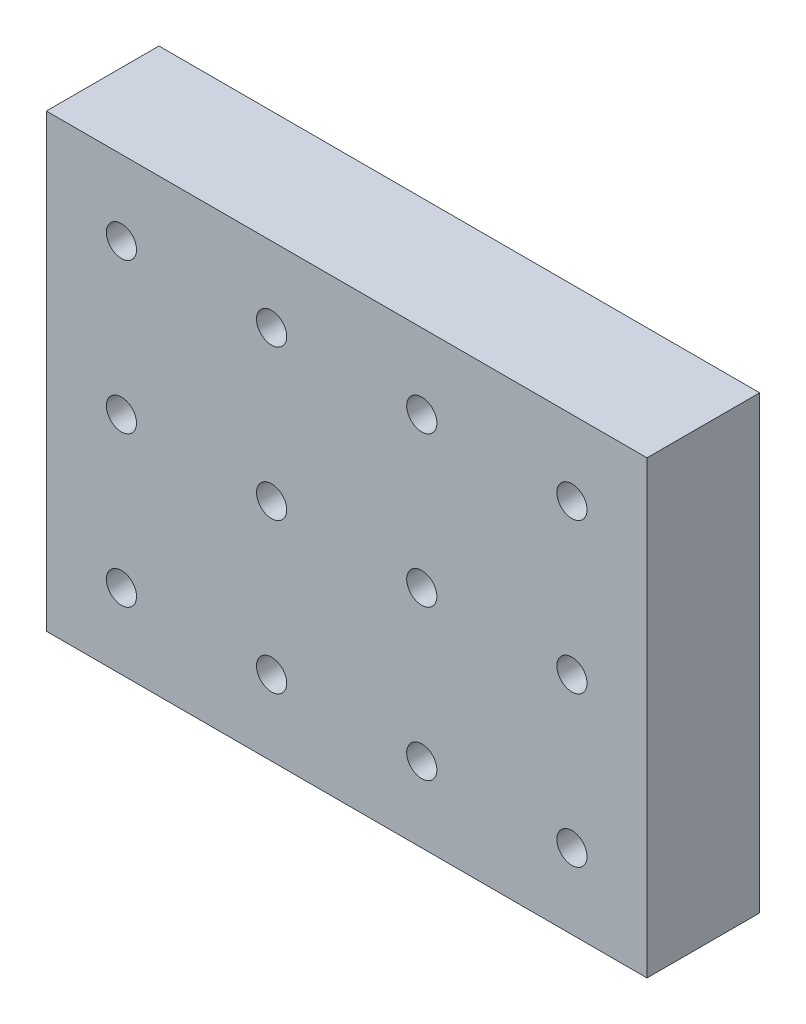
ISO-10303-21;
HEADER;
FILE_DESCRIPTION(('STEP AP214'),'2;1');
FILE_NAME('part.step','',(''),(''),'','','');
FILE_SCHEMA(('AUTOMOTIVE_DESIGN { 1 0 10303 214 1 1 1 1 }'));
ENDSEC;
DATA;
#1=APPLICATION_CONTEXT('core data for automotive mechanical design processes');
#2=APPLICATION_PROTOCOL_DEFINITION('international standard','automotive_design',2000,#1);
#3=PRODUCT_CONTEXT('',#1,'mechanical');
#4=PRODUCT('Part','Part','',(#3));
#5=PRODUCT_RELATED_PRODUCT_CATEGORY('part','',(#4));
#6=PRODUCT_DEFINITION_FORMATION('','',#4);
#7=PRODUCT_DEFINITION_CONTEXT('part definition',#1,'design');
#8=PRODUCT_DEFINITION('design','',#6,#7);
#9=PRODUCT_DEFINITION_SHAPE('','',#8);
#10=(LENGTH_UNIT() NAMED_UNIT(*) SI_UNIT(.MILLI.,.METRE.));
#11=(NAMED_UNIT(*) PLANE_ANGLE_UNIT() SI_UNIT($,.RADIAN.));
#12=(NAMED_UNIT(*) SI_UNIT($,.STERADIAN.) SOLID_ANGLE_UNIT());
#13=UNCERTAINTY_MEASURE_WITH_UNIT(LENGTH_MEASURE(1.E-05),#10,'distance_accuracy_value','');
#14=(GEOMETRIC_REPRESENTATION_CONTEXT(3) GLOBAL_UNCERTAINTY_ASSIGNED_CONTEXT((#13)) GLOBAL_UNIT_ASSIGNED_CONTEXT((#10,
#11,#12)) REPRESENTATION_CONTEXT('',''));
#15=CARTESIAN_POINT('',(0.,0.,0.));
#16=DIRECTION('',(0.,0.,1.));
#17=DIRECTION('',(1.,0.,0.));
#18=AXIS2_PLACEMENT_3D('',#15,#16,#17);
#19=CARTESIAN_POINT('',(88.9,12.7,19.05));
#20=DIRECTION('',(0.,0.,1.));
#21=DIRECTION('',(1.,0.,0.));
#22=AXIS2_PLACEMENT_3D('',#19,#20,#21);
#23=CYLINDRICAL_SURFACE('',#22,2.5527);
#24=CARTESIAN_POINT('',(88.9,12.7,0.));
#25=DIRECTION('',(0.,0.,1.));
#26=DIRECTION('',(1.,0.,0.));
#27=AXIS2_PLACEMENT_3D('',#24,#25,#26);
#28=CIRCLE('',#27,2.55269999999999);
#29=CARTESIAN_POINT('',(91.4527,12.7,0.));
#30=VERTEX_POINT('',#29);
#31=EDGE_CURVE('E45',#30,#30,#28,.T.);
#32=ORIENTED_EDGE('',*,*,#31,.F.);
#33=EDGE_LOOP('',(#32));
#34=FACE_BOUND('',#33,.T.);
#35=CARTESIAN_POINT('',(88.9,12.7,19.05));
#36=DIRECTION('',(0.,0.,1.));
#37=DIRECTION('',(1.,0.,0.));
#38=AXIS2_PLACEMENT_3D('',#35,#36,#37);
#39=CIRCLE('',#38,2.5527);
#40=CARTESIAN_POINT('',(91.4527,12.7,19.05));
#41=VERTEX_POINT('',#40);
#42=EDGE_CURVE('E11',#41,#41,#39,.T.);
#43=ORIENTED_EDGE('',*,*,#42,.T.);
#44=EDGE_LOOP('',(#43));
#45=FACE_BOUND('',#44,.T.);
#46=ADVANCED_FACE('F37',(#34,#45),#23,.F.);
#47=CARTESIAN_POINT('',(63.5,12.7,19.05));
#48=DIRECTION('',(0.,0.,1.));
#49=DIRECTION('',(1.,0.,0.));
#50=AXIS2_PLACEMENT_3D('',#47,#48,#49);
#51=CYLINDRICAL_SURFACE('',#50,2.5527);
#52=CARTESIAN_POINT('',(63.5,12.7,0.));
#53=DIRECTION('',(0.,0.,1.));
#54=DIRECTION('',(1.,0.,0.));
#55=AXIS2_PLACEMENT_3D('',#52,#53,#54);
#56=CIRCLE('',#55,2.55269999999999);
#57=CARTESIAN_POINT('',(66.0527,12.7,0.));
#58=VERTEX_POINT('',#57);
#59=EDGE_CURVE('E157',#58,#58,#56,.T.);
#60=ORIENTED_EDGE('',*,*,#59,.F.);
#61=EDGE_LOOP('',(#60));
#62=FACE_BOUND('',#61,.T.);
#63=CARTESIAN_POINT('',(63.5,12.7,19.05));
#64=DIRECTION('',(0.,0.,1.));
#65=DIRECTION('',(1.,0.,0.));
#66=AXIS2_PLACEMENT_3D('',#63,#64,#65);
#67=CIRCLE('',#66,2.5527);
#68=CARTESIAN_POINT('',(66.0527,12.7,19.05));
#69=VERTEX_POINT('',#68);
#70=EDGE_CURVE('E160',#69,#69,#67,.T.);
#71=ORIENTED_EDGE('',*,*,#70,.T.);
#72=EDGE_LOOP('',(#71));
#73=FACE_BOUND('',#72,.T.);
#74=ADVANCED_FACE('F169',(#62,#73),#51,.F.);
#75=CARTESIAN_POINT('',(38.1,12.7,19.05));
#76=DIRECTION('',(0.,0.,1.));
#77=DIRECTION('',(1.,0.,0.));
#78=AXIS2_PLACEMENT_3D('',#75,#76,#77);
#79=CYLINDRICAL_SURFACE('',#78,2.5527);
#80=CARTESIAN_POINT('',(38.1,12.7,0.));
#81=DIRECTION('',(0.,0.,1.));
#82=DIRECTION('',(1.,0.,0.));
#83=AXIS2_PLACEMENT_3D('',#80,#81,#82);
#84=CIRCLE('',#83,2.55269999999999);
#85=CARTESIAN_POINT('',(40.6527,12.7,0.));
#86=VERTEX_POINT('',#85);
#87=EDGE_CURVE('E151',#86,#86,#84,.T.);
#88=ORIENTED_EDGE('',*,*,#87,.F.);
#89=EDGE_LOOP('',(#88));
#90=FACE_BOUND('',#89,.T.);
#91=CARTESIAN_POINT('',(38.1,12.7,19.05));
#92=DIRECTION('',(0.,0.,1.));
#93=DIRECTION('',(1.,0.,0.));
#94=AXIS2_PLACEMENT_3D('',#91,#92,#93);
#95=CIRCLE('',#94,2.5527);
#96=CARTESIAN_POINT('',(40.6527,12.7,19.05));
#97=VERTEX_POINT('',#96);
#98=EDGE_CURVE('E154',#97,#97,#95,.T.);
#99=ORIENTED_EDGE('',*,*,#98,.T.);
#100=EDGE_LOOP('',(#99));
#101=FACE_BOUND('',#100,.T.);
#102=ADVANCED_FACE('F220',(#90,#101),#79,.F.);
#103=CARTESIAN_POINT('',(12.7,12.7,19.05));
#104=DIRECTION('',(0.,0.,1.));
#105=DIRECTION('',(1.,0.,0.));
#106=AXIS2_PLACEMENT_3D('',#103,#104,#105);
#107=CYLINDRICAL_SURFACE('',#106,2.5527);
#108=CARTESIAN_POINT('',(12.7,12.7,0.));
#109=DIRECTION('',(0.,0.,1.));
#110=DIRECTION('',(1.,0.,0.));
#111=AXIS2_PLACEMENT_3D('',#108,#109,#110);
#112=CIRCLE('',#111,2.55269999999999);
#113=CARTESIAN_POINT('',(15.2527,12.7,0.));
#114=VERTEX_POINT('',#113);
#115=EDGE_CURVE('E145',#114,#114,#112,.T.);
#116=ORIENTED_EDGE('',*,*,#115,.F.);
#117=EDGE_LOOP('',(#116));
#118=FACE_BOUND('',#117,.T.);
#119=CARTESIAN_POINT('',(12.7,12.7,19.05));
#120=DIRECTION('',(0.,0.,1.));
#121=DIRECTION('',(1.,0.,0.));
#122=AXIS2_PLACEMENT_3D('',#119,#120,#121);
#123=CIRCLE('',#122,2.5527);
#124=CARTESIAN_POINT('',(15.2527,12.7,19.05));
#125=VERTEX_POINT('',#124);
#126=EDGE_CURVE('E148',#125,#125,#123,.T.);
#127=ORIENTED_EDGE('',*,*,#126,.T.);
#128=EDGE_LOOP('',(#127));
#129=FACE_BOUND('',#128,.T.);
#130=ADVANCED_FACE('F216',(#118,#129),#107,.F.);
#131=CARTESIAN_POINT('',(88.9,38.1,19.05));
#132=DIRECTION('',(0.,0.,1.));
#133=DIRECTION('',(1.,0.,0.));
#134=AXIS2_PLACEMENT_3D('',#131,#132,#133);
#135=CYLINDRICAL_SURFACE('',#134,2.5527);
#136=CARTESIAN_POINT('',(88.9,38.1,0.));
#137=DIRECTION('',(0.,0.,1.));
#138=DIRECTION('',(1.,0.,0.));
#139=AXIS2_PLACEMENT_3D('',#136,#137,#138);
#140=CIRCLE('',#139,2.55269999999999);
#141=CARTESIAN_POINT('',(91.4527,38.1,0.));
#142=VERTEX_POINT('',#141);
#143=EDGE_CURVE('E139',#142,#142,#140,.T.);
#144=ORIENTED_EDGE('',*,*,#143,.F.);
#145=EDGE_LOOP('',(#144));
#146=FACE_BOUND('',#145,.T.);
#147=CARTESIAN_POINT('',(88.9,38.1,19.05));
#148=DIRECTION('',(0.,0.,1.));
#149=DIRECTION('',(1.,0.,0.));
#150=AXIS2_PLACEMENT_3D('',#147,#148,#149);
#151=CIRCLE('',#150,2.5527);
#152=CARTESIAN_POINT('',(91.4527,38.1,19.05));
#153=VERTEX_POINT('',#152);
#154=EDGE_CURVE('E142',#153,#153,#151,.T.);
#155=ORIENTED_EDGE('',*,*,#154,.T.);
#156=EDGE_LOOP('',(#155));
#157=FACE_BOUND('',#156,.T.);
#158=ADVANCED_FACE('F212',(#146,#157),#135,.F.);
#159=CARTESIAN_POINT('',(12.7,38.1,19.05));
#160=DIRECTION('',(0.,0.,1.));
#161=DIRECTION('',(1.,0.,0.));
#162=AXIS2_PLACEMENT_3D('',#159,#160,#161);
#163=CYLINDRICAL_SURFACE('',#162,2.5527);
#164=CARTESIAN_POINT('',(12.7,38.1,0.));
#165=DIRECTION('',(0.,0.,1.));
#166=DIRECTION('',(1.,0.,0.));
#167=AXIS2_PLACEMENT_3D('',#164,#165,#166);
#168=CIRCLE('',#167,2.55269999999999);
#169=CARTESIAN_POINT('',(15.2527,38.1,0.));
#170=VERTEX_POINT('',#169);
#171=EDGE_CURVE('E133',#170,#170,#168,.T.);
#172=ORIENTED_EDGE('',*,*,#171,.F.);
#173=EDGE_LOOP('',(#172));
#174=FACE_BOUND('',#173,.T.);
#175=CARTESIAN_POINT('',(12.7,38.1,19.05));
#176=DIRECTION('',(0.,0.,1.));
#177=DIRECTION('',(1.,0.,0.));
#178=AXIS2_PLACEMENT_3D('',#175,#176,#177);
#179=CIRCLE('',#178,2.5527);
#180=CARTESIAN_POINT('',(15.2527,38.1,19.05));
#181=VERTEX_POINT('',#180);
#182=EDGE_CURVE('E136',#181,#181,#179,.T.);
#183=ORIENTED_EDGE('',*,*,#182,.T.);
#184=EDGE_LOOP('',(#183));
#185=FACE_BOUND('',#184,.T.);
#186=ADVANCED_FACE('F208',(#174,#185),#163,.F.);
#187=CARTESIAN_POINT('',(88.9,63.5,19.05));
#188=DIRECTION('',(0.,0.,1.));
#189=DIRECTION('',(1.,0.,0.));
#190=AXIS2_PLACEMENT_3D('',#187,#188,#189);
#191=CYLINDRICAL_SURFACE('',#190,2.5527);
#192=CARTESIAN_POINT('',(88.9,63.5,0.));
#193=DIRECTION('',(0.,0.,1.));
#194=DIRECTION('',(1.,0.,0.));
#195=AXIS2_PLACEMENT_3D('',#192,#193,#194);
#196=CIRCLE('',#195,2.55269999999999);
#197=CARTESIAN_POINT('',(91.4527,63.5,0.));
#198=VERTEX_POINT('',#197);
#199=EDGE_CURVE('E127',#198,#198,#196,.T.);
#200=ORIENTED_EDGE('',*,*,#199,.F.);
#201=EDGE_LOOP('',(#200));
#202=FACE_BOUND('',#201,.T.);
#203=CARTESIAN_POINT('',(88.9,63.5,19.05));
#204=DIRECTION('',(0.,0.,1.));
#205=DIRECTION('',(1.,0.,0.));
#206=AXIS2_PLACEMENT_3D('',#203,#204,#205);
#207=CIRCLE('',#206,2.5527);
#208=CARTESIAN_POINT('',(91.4527,63.5,19.05));
#209=VERTEX_POINT('',#208);
#210=EDGE_CURVE('E130',#209,#209,#207,.T.);
#211=ORIENTED_EDGE('',*,*,#210,.T.);
#212=EDGE_LOOP('',(#211));
#213=FACE_BOUND('',#212,.T.);
#214=ADVANCED_FACE('F204',(#202,#213),#191,.F.);
#215=CARTESIAN_POINT('',(63.5,63.5,19.05));
#216=DIRECTION('',(0.,0.,1.));
#217=DIRECTION('',(1.,0.,0.));
#218=AXIS2_PLACEMENT_3D('',#215,#216,#217);
#219=CYLINDRICAL_SURFACE('',#218,2.5527);
#220=CARTESIAN_POINT('',(63.5,63.5,0.));
#221=DIRECTION('',(0.,0.,1.));
#222=DIRECTION('',(1.,0.,0.));
#223=AXIS2_PLACEMENT_3D('',#220,#221,#222);
#224=CIRCLE('',#223,2.55269999999999);
#225=CARTESIAN_POINT('',(66.0527,63.5,0.));
#226=VERTEX_POINT('',#225);
#227=EDGE_CURVE('E121',#226,#226,#224,.T.);
#228=ORIENTED_EDGE('',*,*,#227,.F.);
#229=EDGE_LOOP('',(#228));
#230=FACE_BOUND('',#229,.T.);
#231=CARTESIAN_POINT('',(63.5,63.5,19.05));
#232=DIRECTION('',(0.,0.,1.));
#233=DIRECTION('',(1.,0.,0.));
#234=AXIS2_PLACEMENT_3D('',#231,#232,#233);
#235=CIRCLE('',#234,2.5527);
#236=CARTESIAN_POINT('',(66.0527,63.5,19.05));
#237=VERTEX_POINT('',#236);
#238=EDGE_CURVE('E124',#237,#237,#235,.T.);
#239=ORIENTED_EDGE('',*,*,#238,.T.);
#240=EDGE_LOOP('',(#239));
#241=FACE_BOUND('',#240,.T.);
#242=ADVANCED_FACE('F200',(#230,#241),#219,.F.);
#243=CARTESIAN_POINT('',(63.5,38.1,19.05));
#244=DIRECTION('',(0.,0.,1.));
#245=DIRECTION('',(1.,0.,0.));
#246=AXIS2_PLACEMENT_3D('',#243,#244,#245);
#247=CYLINDRICAL_SURFACE('',#246,2.5527);
#248=CARTESIAN_POINT('',(63.5,38.1,0.));
#249=DIRECTION('',(0.,0.,1.));
#250=DIRECTION('',(1.,0.,0.));
#251=AXIS2_PLACEMENT_3D('',#248,#249,#250);
#252=CIRCLE('',#251,2.55269999999999);
#253=CARTESIAN_POINT('',(66.0527,38.1,0.));
#254=VERTEX_POINT('',#253);
#255=EDGE_CURVE('E115',#254,#254,#252,.T.);
#256=ORIENTED_EDGE('',*,*,#255,.F.);
#257=EDGE_LOOP('',(#256));
#258=FACE_BOUND('',#257,.T.);
#259=CARTESIAN_POINT('',(63.5,38.1,19.05));
#260=DIRECTION('',(0.,0.,1.));
#261=DIRECTION('',(1.,0.,0.));
#262=AXIS2_PLACEMENT_3D('',#259,#260,#261);
#263=CIRCLE('',#262,2.5527);
#264=CARTESIAN_POINT('',(66.0527,38.1,19.05));
#265=VERTEX_POINT('',#264);
#266=EDGE_CURVE('E118',#265,#265,#263,.T.);
#267=ORIENTED_EDGE('',*,*,#266,.T.);
#268=EDGE_LOOP('',(#267));
#269=FACE_BOUND('',#268,.T.);
#270=ADVANCED_FACE('F196',(#258,#269),#247,.F.);
#271=CARTESIAN_POINT('',(0.,0.,19.05));
#272=DIRECTION('',(1.,0.,0.));
#273=DIRECTION('',(0.,0.,-1.));
#274=AXIS2_PLACEMENT_3D('',#271,#272,#273);
#275=PLANE('',#274);
#276=DIRECTION('',(0.,-1.,0.));
#277=VECTOR('',#276,1.);
#278=CARTESIAN_POINT('',(0.,0.,0.));
#279=LINE('',#278,#277);
#280=CARTESIAN_POINT('',(0.,76.2,0.));
#281=VERTEX_POINT('',#280);
#282=CARTESIAN_POINT('',(0.,0.,0.));
#283=VERTEX_POINT('',#282);
#284=EDGE_CURVE('E105',#281,#283,#279,.T.);
#285=ORIENTED_EDGE('',*,*,#284,.T.);
#286=DIRECTION('',(0.,0.,-1.));
#287=VECTOR('',#286,1.);
#288=CARTESIAN_POINT('',(0.,0.,19.05));
#289=LINE('',#288,#287);
#290=CARTESIAN_POINT('',(0.,0.,19.05));
#291=VERTEX_POINT('',#290);
#292=EDGE_CURVE('E96',#291,#283,#289,.T.);
#293=ORIENTED_EDGE('',*,*,#292,.F.);
#294=DIRECTION('',(0.,-1.,0.));
#295=VECTOR('',#294,1.);
#296=CARTESIAN_POINT('',(0.,0.,19.05));
#297=LINE('',#296,#295);
#298=CARTESIAN_POINT('',(0.,76.2,19.05));
#299=VERTEX_POINT('',#298);
#300=EDGE_CURVE('E90',#299,#291,#297,.T.);
#301=ORIENTED_EDGE('',*,*,#300,.F.);
#302=DIRECTION('',(0.,0.,-1.));
#303=VECTOR('',#302,1.);
#304=CARTESIAN_POINT('',(0.,76.2,19.05));
#305=LINE('',#304,#303);
#306=EDGE_CURVE('E101',#299,#281,#305,.T.);
#307=ORIENTED_EDGE('',*,*,#306,.T.);
#308=EDGE_LOOP('',(#285,#293,#301,#307));
#309=FACE_BOUND('',#308,.T.);
#310=ADVANCED_FACE('F193',(#309),#275,.F.);
#311=CARTESIAN_POINT('',(0.,0.,19.05));
#312=DIRECTION('',(0.,1.,0.));
#313=DIRECTION('',(0.,0.,1.));
#314=AXIS2_PLACEMENT_3D('',#311,#312,#313);
#315=PLANE('',#314);
#316=DIRECTION('',(1.,0.,0.));
#317=VECTOR('',#316,1.);
#318=CARTESIAN_POINT('',(0.,0.,0.));
#319=LINE('',#318,#317);
#320=CARTESIAN_POINT('',(101.6,0.,0.));
#321=VERTEX_POINT('',#320);
#322=EDGE_CURVE('E95',#283,#321,#319,.T.);
#323=ORIENTED_EDGE('',*,*,#322,.T.);
#324=DIRECTION('',(0.,0.,-1.));
#325=VECTOR('',#324,1.);
#326=CARTESIAN_POINT('',(101.6,0.,19.05));
#327=LINE('',#326,#325);
#328=CARTESIAN_POINT('',(101.6,0.,19.05));
#329=VERTEX_POINT('',#328);
#330=EDGE_CURVE('E93',#329,#321,#327,.T.);
#331=ORIENTED_EDGE('',*,*,#330,.F.);
#332=DIRECTION('',(1.,0.,0.));
#333=VECTOR('',#332,1.);
#334=CARTESIAN_POINT('',(0.,0.,19.05));
#335=LINE('',#334,#333);
#336=EDGE_CURVE('E84',#291,#329,#335,.T.);
#337=ORIENTED_EDGE('',*,*,#336,.F.);
#338=ORIENTED_EDGE('',*,*,#292,.T.);
#339=EDGE_LOOP('',(#323,#331,#337,#338));
#340=FACE_BOUND('',#339,.T.);
#341=ADVANCED_FACE('F94',(#340),#315,.F.);
#342=CARTESIAN_POINT('',(101.6,0.,19.05));
#343=DIRECTION('',(-1.,0.,0.));
#344=DIRECTION('',(0.,0.,1.));
#345=AXIS2_PLACEMENT_3D('',#342,#343,#344);
#346=PLANE('',#345);
#347=DIRECTION('',(0.,1.,0.));
#348=VECTOR('',#347,1.);
#349=CARTESIAN_POINT('',(101.6,0.,0.));
#350=LINE('',#349,#348);
#351=CARTESIAN_POINT('',(101.6,76.2,0.));
#352=VERTEX_POINT('',#351);
#353=EDGE_CURVE('E70',#321,#352,#350,.T.);
#354=ORIENTED_EDGE('',*,*,#353,.T.);
#355=DIRECTION('',(0.,0.,-1.));
#356=VECTOR('',#355,1.);
#357=CARTESIAN_POINT('',(101.6,76.2,19.05));
#358=LINE('',#357,#356);
#359=CARTESIAN_POINT('',(101.6,76.2,19.05));
#360=VERTEX_POINT('',#359);
#361=EDGE_CURVE('E97',#360,#352,#358,.T.);
#362=ORIENTED_EDGE('',*,*,#361,.F.);
#363=DIRECTION('',(0.,1.,0.));
#364=VECTOR('',#363,1.);
#365=CARTESIAN_POINT('',(101.6,0.,19.05));
#366=LINE('',#365,#364);
#367=EDGE_CURVE('E88',#329,#360,#366,.T.);
#368=ORIENTED_EDGE('',*,*,#367,.F.);
#369=ORIENTED_EDGE('',*,*,#330,.T.);
#370=EDGE_LOOP('',(#354,#362,#368,#369));
#371=FACE_BOUND('',#370,.T.);
#372=ADVANCED_FACE('F99',(#371),#346,.F.);
#373=CARTESIAN_POINT('',(0.,76.2,19.05));
#374=DIRECTION('',(0.,-1.,0.));
#375=DIRECTION('',(0.,0.,-1.));
#376=AXIS2_PLACEMENT_3D('',#373,#374,#375);
#377=PLANE('',#376);
#378=DIRECTION('',(-1.,0.,0.));
#379=VECTOR('',#378,1.);
#380=CARTESIAN_POINT('',(0.,76.2,0.));
#381=LINE('',#380,#379);
#382=EDGE_CURVE('E76',#352,#281,#381,.T.);
#383=ORIENTED_EDGE('',*,*,#382,.T.);
#384=ORIENTED_EDGE('',*,*,#306,.F.);
#385=DIRECTION('',(-1.,0.,0.));
#386=VECTOR('',#385,1.);
#387=CARTESIAN_POINT('',(0.,76.2,19.05));
#388=LINE('',#387,#386);
#389=EDGE_CURVE('E53',#360,#299,#388,.T.);
#390=ORIENTED_EDGE('',*,*,#389,.F.);
#391=ORIENTED_EDGE('',*,*,#361,.T.);
#392=EDGE_LOOP('',(#383,#384,#390,#391));
#393=FACE_BOUND('',#392,.T.);
#394=ADVANCED_FACE('F173',(#393),#377,.F.);
#395=CARTESIAN_POINT('',(0.,0.,19.05));
#396=DIRECTION('',(0.,0.,-1.));
#397=DIRECTION('',(-1.,0.,0.));
#398=AXIS2_PLACEMENT_3D('',#395,#396,#397);
#399=PLANE('',#398);
#400=CARTESIAN_POINT('',(38.1,63.5,19.05));
#401=DIRECTION('',(0.,0.,1.));
#402=DIRECTION('',(1.,0.,0.));
#403=AXIS2_PLACEMENT_3D('',#400,#401,#402);
#404=CIRCLE('',#403,2.5527);
#405=CARTESIAN_POINT('',(40.6527,63.5,19.05));
#406=VERTEX_POINT('',#405);
#407=EDGE_CURVE('E418',#406,#406,#404,.T.);
#408=ORIENTED_EDGE('',*,*,#407,.F.);
#409=EDGE_LOOP('',(#408));
#410=FACE_BOUND('',#409,.T.);
#411=CARTESIAN_POINT('',(38.1,38.1,19.05));
#412=DIRECTION('',(0.,0.,1.));
#413=DIRECTION('',(1.,0.,0.));
#414=AXIS2_PLACEMENT_3D('',#411,#412,#413);
#415=CIRCLE('',#414,2.5527);
#416=CARTESIAN_POINT('',(40.6527,38.1,19.05));
#417=VERTEX_POINT('',#416);
#418=EDGE_CURVE('E422',#417,#417,#415,.T.);
#419=ORIENTED_EDGE('',*,*,#418,.F.);
#420=EDGE_LOOP('',(#419));
#421=FACE_BOUND('',#420,.T.);
#422=CARTESIAN_POINT('',(12.7,63.5,19.05));
#423=DIRECTION('',(0.,0.,1.));
#424=DIRECTION('',(1.,0.,0.));
#425=AXIS2_PLACEMENT_3D('',#422,#423,#424);
#426=CIRCLE('',#425,2.5527);
#427=CARTESIAN_POINT('',(15.2527,63.5,19.05));
#428=VERTEX_POINT('',#427);
#429=EDGE_CURVE('E428',#428,#428,#426,.T.);
#430=ORIENTED_EDGE('',*,*,#429,.F.);
#431=EDGE_LOOP('',(#430));
#432=FACE_BOUND('',#431,.T.);
#433=ORIENTED_EDGE('',*,*,#300,.T.);
#434=ORIENTED_EDGE('',*,*,#336,.T.);
#435=ORIENTED_EDGE('',*,*,#367,.T.);
#436=ORIENTED_EDGE('',*,*,#389,.T.);
#437=EDGE_LOOP('',(#433,#434,#435,#436));
#438=FACE_BOUND('',#437,.T.);
#439=ORIENTED_EDGE('',*,*,#266,.F.);
#440=EDGE_LOOP('',(#439));
#441=FACE_BOUND('',#440,.T.);
#442=ORIENTED_EDGE('',*,*,#238,.F.);
#443=EDGE_LOOP('',(#442));
#444=FACE_BOUND('',#443,.T.);
#445=ORIENTED_EDGE('',*,*,#210,.F.);
#446=EDGE_LOOP('',(#445));
#447=FACE_BOUND('',#446,.T.);
#448=ORIENTED_EDGE('',*,*,#182,.F.);
#449=EDGE_LOOP('',(#448));
#450=FACE_BOUND('',#449,.T.);
#451=ORIENTED_EDGE('',*,*,#154,.F.);
#452=EDGE_LOOP('',(#451));
#453=FACE_BOUND('',#452,.T.);
#454=ORIENTED_EDGE('',*,*,#126,.F.);
#455=EDGE_LOOP('',(#454));
#456=FACE_BOUND('',#455,.T.);
#457=ORIENTED_EDGE('',*,*,#98,.F.);
#458=EDGE_LOOP('',(#457));
#459=FACE_BOUND('',#458,.T.);
#460=ORIENTED_EDGE('',*,*,#70,.F.);
#461=EDGE_LOOP('',(#460));
#462=FACE_BOUND('',#461,.T.);
#463=ORIENTED_EDGE('',*,*,#42,.F.);
#464=EDGE_LOOP('',(#463));
#465=FACE_BOUND('',#464,.T.);
#466=ADVANCED_FACE('F85',(#410,#421,#432,#438,#441,#444,#447,#450,#453,#456,#459,#462,#465),
#399,.F.);
#467=CARTESIAN_POINT('',(0.,0.,0.));
#468=DIRECTION('',(0.,0.,-1.));
#469=DIRECTION('',(-1.,0.,0.));
#470=AXIS2_PLACEMENT_3D('',#467,#468,#469);
#471=PLANE('',#470);
#472=CARTESIAN_POINT('',(38.1,63.5,0.));
#473=DIRECTION('',(0.,0.,1.));
#474=DIRECTION('',(1.,0.,0.));
#475=AXIS2_PLACEMENT_3D('',#472,#473,#474);
#476=CIRCLE('',#475,2.55269999999999);
#477=CARTESIAN_POINT('',(40.6527,63.5,0.));
#478=VERTEX_POINT('',#477);
#479=EDGE_CURVE('E416',#478,#478,#476,.T.);
#480=ORIENTED_EDGE('',*,*,#479,.T.);
#481=EDGE_LOOP('',(#480));
#482=FACE_BOUND('',#481,.T.);
#483=CARTESIAN_POINT('',(38.1,38.1,0.));
#484=DIRECTION('',(0.,0.,1.));
#485=DIRECTION('',(1.,0.,0.));
#486=AXIS2_PLACEMENT_3D('',#483,#484,#485);
#487=CIRCLE('',#486,2.55269999999999);
#488=CARTESIAN_POINT('',(40.6527,38.1,0.));
#489=VERTEX_POINT('',#488);
#490=EDGE_CURVE('E419',#489,#489,#487,.T.);
#491=ORIENTED_EDGE('',*,*,#490,.T.);
#492=EDGE_LOOP('',(#491));
#493=FACE_BOUND('',#492,.T.);
#494=CARTESIAN_POINT('',(12.7,63.5,0.));
#495=DIRECTION('',(0.,0.,1.));
#496=DIRECTION('',(1.,0.,0.));
#497=AXIS2_PLACEMENT_3D('',#494,#495,#496);
#498=CIRCLE('',#497,2.55269999999999);
#499=CARTESIAN_POINT('',(15.2527,63.5,0.));
#500=VERTEX_POINT('',#499);
#501=EDGE_CURVE('E108',#500,#500,#498,.T.);
#502=ORIENTED_EDGE('',*,*,#501,.T.);
#503=EDGE_LOOP('',(#502));
#504=FACE_BOUND('',#503,.T.);
#505=ORIENTED_EDGE('',*,*,#284,.F.);
#506=ORIENTED_EDGE('',*,*,#382,.F.);
#507=ORIENTED_EDGE('',*,*,#353,.F.);
#508=ORIENTED_EDGE('',*,*,#322,.F.);
#509=EDGE_LOOP('',(#505,#506,#507,#508));
#510=FACE_BOUND('',#509,.T.);
#511=ORIENTED_EDGE('',*,*,#255,.T.);
#512=EDGE_LOOP('',(#511));
#513=FACE_BOUND('',#512,.T.);
#514=ORIENTED_EDGE('',*,*,#227,.T.);
#515=EDGE_LOOP('',(#514));
#516=FACE_BOUND('',#515,.T.);
#517=ORIENTED_EDGE('',*,*,#199,.T.);
#518=EDGE_LOOP('',(#517));
#519=FACE_BOUND('',#518,.T.);
#520=ORIENTED_EDGE('',*,*,#171,.T.);
#521=EDGE_LOOP('',(#520));
#522=FACE_BOUND('',#521,.T.);
#523=ORIENTED_EDGE('',*,*,#143,.T.);
#524=EDGE_LOOP('',(#523));
#525=FACE_BOUND('',#524,.T.);
#526=ORIENTED_EDGE('',*,*,#115,.T.);
#527=EDGE_LOOP('',(#526));
#528=FACE_BOUND('',#527,.T.);
#529=ORIENTED_EDGE('',*,*,#87,.T.);
#530=EDGE_LOOP('',(#529));
#531=FACE_BOUND('',#530,.T.);
#532=ORIENTED_EDGE('',*,*,#59,.T.);
#533=EDGE_LOOP('',(#532));
#534=FACE_BOUND('',#533,.T.);
#535=ORIENTED_EDGE('',*,*,#31,.T.);
#536=EDGE_LOOP('',(#535));
#537=FACE_BOUND('',#536,.T.);
#538=ADVANCED_FACE('F165',(#482,#493,#504,#510,#513,#516,#519,#522,#525,#528,#531,#534,#537),
#471,.T.);
#539=CARTESIAN_POINT('',(12.7,63.5,19.05));
#540=DIRECTION('',(0.,0.,1.));
#541=DIRECTION('',(1.,0.,0.));
#542=AXIS2_PLACEMENT_3D('',#539,#540,#541);
#543=CYLINDRICAL_SURFACE('',#542,2.5527);
#544=ORIENTED_EDGE('',*,*,#501,.F.);
#545=EDGE_LOOP('',(#544));
#546=FACE_BOUND('',#545,.T.);
#547=ORIENTED_EDGE('',*,*,#429,.T.);
#548=EDGE_LOOP('',(#547));
#549=FACE_BOUND('',#548,.T.);
#550=ADVANCED_FACE('F180',(#546,#549),#543,.F.);
#551=CARTESIAN_POINT('',(38.1,38.1,19.05));
#552=DIRECTION('',(0.,0.,1.));
#553=DIRECTION('',(1.,0.,0.));
#554=AXIS2_PLACEMENT_3D('',#551,#552,#553);
#555=CYLINDRICAL_SURFACE('',#554,2.5527);
#556=ORIENTED_EDGE('',*,*,#490,.F.);
#557=EDGE_LOOP('',(#556));
#558=FACE_BOUND('',#557,.T.);
#559=ORIENTED_EDGE('',*,*,#418,.T.);
#560=EDGE_LOOP('',(#559));
#561=FACE_BOUND('',#560,.T.);
#562=ADVANCED_FACE('F292',(#558,#561),#555,.F.);
#563=CARTESIAN_POINT('',(38.1,63.5,19.05));
#564=DIRECTION('',(0.,0.,1.));
#565=DIRECTION('',(1.,0.,0.));
#566=AXIS2_PLACEMENT_3D('',#563,#564,#565);
#567=CYLINDRICAL_SURFACE('',#566,2.5527);
#568=ORIENTED_EDGE('',*,*,#479,.F.);
#569=EDGE_LOOP('',(#568));
#570=FACE_BOUND('',#569,.T.);
#571=ORIENTED_EDGE('',*,*,#407,.T.);
#572=EDGE_LOOP('',(#571));
#573=FACE_BOUND('',#572,.T.);
#574=ADVANCED_FACE('F370',(#570,#573),#567,.F.);
#575=CLOSED_SHELL('',(#46,#74,#102,#130,#158,#186,#214,#242,#270,#310,#341,#372,#394,#466,#538,
#550,#562,#574));
#576=MANIFOLD_SOLID_BREP('B2',#575);
#577=ADVANCED_BREP_SHAPE_REPRESENTATION('',(#18,#576),#14);
#578=SHAPE_DEFINITION_REPRESENTATION(#9,#577);
ENDSEC;
END-ISO-10303-21;
